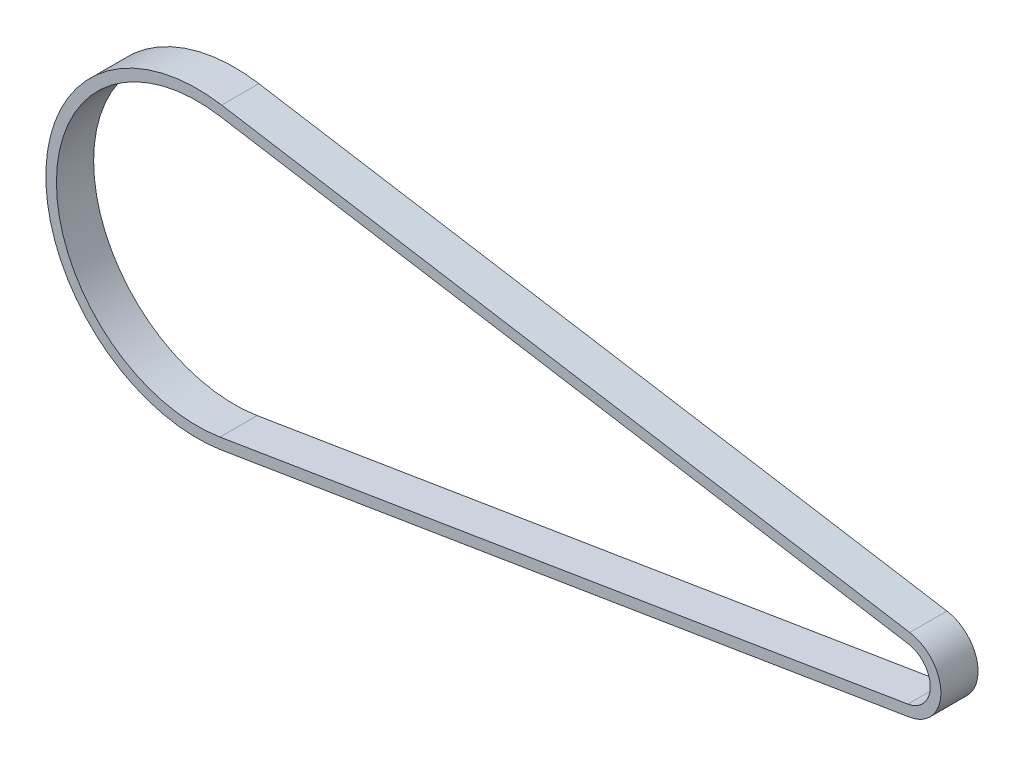
ISO-10303-21;
HEADER;
FILE_DESCRIPTION(('STEP AP214'),'2;1');
FILE_NAME('part.step','',(''),(''),'','','');
FILE_SCHEMA(('AUTOMOTIVE_DESIGN { 1 0 10303 214 1 1 1 1 }'));
ENDSEC;
DATA;
#1=APPLICATION_CONTEXT('core data for automotive mechanical design processes');
#2=APPLICATION_PROTOCOL_DEFINITION('international standard','automotive_design',2000,#1);
#3=PRODUCT_CONTEXT('',#1,'mechanical');
#4=PRODUCT('Part','Part','',(#3));
#5=PRODUCT_RELATED_PRODUCT_CATEGORY('part','',(#4));
#6=PRODUCT_DEFINITION_FORMATION('','',#4);
#7=PRODUCT_DEFINITION_CONTEXT('part definition',#1,'design');
#8=PRODUCT_DEFINITION('design','',#6,#7);
#9=PRODUCT_DEFINITION_SHAPE('','',#8);
#10=(LENGTH_UNIT() NAMED_UNIT(*) SI_UNIT(.MILLI.,.METRE.));
#11=(NAMED_UNIT(*) PLANE_ANGLE_UNIT() SI_UNIT($,.RADIAN.));
#12=(NAMED_UNIT(*) SI_UNIT($,.STERADIAN.) SOLID_ANGLE_UNIT());
#13=UNCERTAINTY_MEASURE_WITH_UNIT(LENGTH_MEASURE(1.E-05),#10,'distance_accuracy_value','');
#14=(GEOMETRIC_REPRESENTATION_CONTEXT(3) GLOBAL_UNCERTAINTY_ASSIGNED_CONTEXT((#13)) GLOBAL_UNIT_ASSIGNED_CONTEXT((#10,
#11,#12)) REPRESENTATION_CONTEXT('',''));
#15=CARTESIAN_POINT('',(0.,0.,0.));
#16=DIRECTION('',(0.,0.,1.));
#17=DIRECTION('',(1.,0.,0.));
#18=AXIS2_PLACEMENT_3D('',#15,#16,#17);
#19=CARTESIAN_POINT('',(0.,0.,7.));
#20=DIRECTION('',(0.,0.,1.));
#21=DIRECTION('',(1.,0.,0.));
#22=AXIS2_PLACEMENT_3D('',#19,#20,#21);
#23=PLANE('',#22);
#24=CARTESIAN_POINT('',(0.,0.,7.));
#25=DIRECTION('',(0.,0.,1.));
#26=DIRECTION('',(1.,0.,0.));
#27=AXIS2_PLACEMENT_3D('',#24,#25,#26);
#28=CIRCLE('',#27,28.5);
#29=CARTESIAN_POINT('',(4.60714285714286,28.125153060808,7.));
#30=VERTEX_POINT('',#29);
#31=CARTESIAN_POINT('',(4.60714285714286,-28.125153060808,7.));
#32=VERTEX_POINT('',#31);
#33=EDGE_CURVE('E134',#30,#32,#28,.T.);
#34=ORIENTED_EDGE('',*,*,#33,.T.);
#35=DIRECTION('',(0.986847475817825,0.161654135338346,0.));
#36=VECTOR('',#35,1.);
#37=CARTESIAN_POINT('',(4.60714285714286,-28.125153060808,7.));
#38=LINE('',#37,#36);
#39=CARTESIAN_POINT('',(134.131578947368,-6.90793233072476,7.));
#40=VERTEX_POINT('',#39);
#41=EDGE_CURVE('E137',#32,#40,#38,.T.);
#42=ORIENTED_EDGE('',*,*,#41,.T.);
#43=CARTESIAN_POINT('',(133.,0.,7.));
#44=DIRECTION('',(0.,0.,1.));
#45=DIRECTION('',(1.,0.,0.));
#46=AXIS2_PLACEMENT_3D('',#43,#44,#45);
#47=CIRCLE('',#46,6.99999999999999);
#48=CARTESIAN_POINT('',(134.131578947368,6.90793233072476,7.));
#49=VERTEX_POINT('',#48);
#50=EDGE_CURVE('E140',#40,#49,#47,.T.);
#51=ORIENTED_EDGE('',*,*,#50,.T.);
#52=DIRECTION('',(-0.986847475817825,0.161654135338346,0.));
#53=VECTOR('',#52,1.);
#54=CARTESIAN_POINT('',(4.60714285714286,28.125153060808,7.));
#55=LINE('',#54,#53);
#56=EDGE_CURVE('E142',#49,#30,#55,.T.);
#57=ORIENTED_EDGE('',*,*,#56,.T.);
#58=EDGE_LOOP('',(#34,#42,#51,#57));
#59=FACE_BOUND('',#58,.T.);
#60=DIRECTION('',(0.986847475817825,0.161654135338346,0.));
#61=VECTOR('',#60,1.);
#62=CARTESIAN_POINT('',(4.28383458646617,-26.1514581091724,7.));
#63=LINE('',#62,#61);
#64=CARTESIAN_POINT('',(4.28383458646617,-26.1514581091724,7.));
#65=VERTEX_POINT('',#64);
#66=CARTESIAN_POINT('',(133.808270676692,-4.93423737908912,7.));
#67=VERTEX_POINT('',#66);
#68=EDGE_CURVE('E106',#65,#67,#63,.T.);
#69=ORIENTED_EDGE('',*,*,#68,.F.);
#70=CARTESIAN_POINT('',(0.,0.,7.));
#71=DIRECTION('',(0.,0.,1.));
#72=DIRECTION('',(1.,0.,0.));
#73=AXIS2_PLACEMENT_3D('',#70,#71,#72);
#74=CIRCLE('',#73,26.5);
#75=CARTESIAN_POINT('',(4.28383458646617,26.1514581091724,7.));
#76=VERTEX_POINT('',#75);
#77=EDGE_CURVE('E98',#76,#65,#74,.T.);
#78=ORIENTED_EDGE('',*,*,#77,.F.);
#79=DIRECTION('',(-0.986847475817825,0.161654135338346,0.));
#80=VECTOR('',#79,1.);
#81=CARTESIAN_POINT('',(4.28383458646617,26.1514581091724,7.));
#82=LINE('',#81,#80);
#83=CARTESIAN_POINT('',(133.808270676692,4.93423737908911,7.));
#84=VERTEX_POINT('',#83);
#85=EDGE_CURVE('E120',#84,#76,#82,.T.);
#86=ORIENTED_EDGE('',*,*,#85,.F.);
#87=CARTESIAN_POINT('',(133.,0.,7.));
#88=DIRECTION('',(0.,0.,1.));
#89=DIRECTION('',(1.,0.,0.));
#90=AXIS2_PLACEMENT_3D('',#87,#88,#89);
#91=CIRCLE('',#90,4.99999999999999);
#92=EDGE_CURVE('E118',#67,#84,#91,.T.);
#93=ORIENTED_EDGE('',*,*,#92,.F.);
#94=EDGE_LOOP('',(#69,#78,#86,#93));
#95=FACE_BOUND('',#94,.T.);
#96=ADVANCED_FACE('F33',(#59,#95),#23,.T.);
#97=CARTESIAN_POINT('',(0.,0.,0.));
#98=DIRECTION('',(0.,0.,1.));
#99=DIRECTION('',(1.,0.,0.));
#100=AXIS2_PLACEMENT_3D('',#97,#98,#99);
#101=PLANE('',#100);
#102=CARTESIAN_POINT('',(0.,0.,0.));
#103=DIRECTION('',(0.,0.,1.));
#104=DIRECTION('',(1.,0.,0.));
#105=AXIS2_PLACEMENT_3D('',#102,#103,#104);
#106=CIRCLE('',#105,28.5);
#107=CARTESIAN_POINT('',(4.60714285714286,28.125153060808,0.));
#108=VERTEX_POINT('',#107);
#109=CARTESIAN_POINT('',(4.60714285714286,-28.125153060808,0.));
#110=VERTEX_POINT('',#109);
#111=EDGE_CURVE('E114',#108,#110,#106,.T.);
#112=ORIENTED_EDGE('',*,*,#111,.F.);
#113=DIRECTION('',(-0.986847475817825,0.161654135338346,0.));
#114=VECTOR('',#113,1.);
#115=CARTESIAN_POINT('',(4.60714285714286,28.125153060808,0.));
#116=LINE('',#115,#114);
#117=CARTESIAN_POINT('',(134.131578947368,6.90793233072476,0.));
#118=VERTEX_POINT('',#117);
#119=EDGE_CURVE('E138',#118,#108,#116,.T.);
#120=ORIENTED_EDGE('',*,*,#119,.F.);
#121=CARTESIAN_POINT('',(133.,0.,0.));
#122=DIRECTION('',(0.,0.,1.));
#123=DIRECTION('',(1.,0.,0.));
#124=AXIS2_PLACEMENT_3D('',#121,#122,#123);
#125=CIRCLE('',#124,6.99999999999999);
#126=CARTESIAN_POINT('',(134.131578947368,-6.90793233072476,0.));
#127=VERTEX_POINT('',#126);
#128=EDGE_CURVE('E149',#127,#118,#125,.T.);
#129=ORIENTED_EDGE('',*,*,#128,.F.);
#130=DIRECTION('',(0.986847475817825,0.161654135338346,0.));
#131=VECTOR('',#130,1.);
#132=CARTESIAN_POINT('',(4.60714285714286,-28.125153060808,0.));
#133=LINE('',#132,#131);
#134=EDGE_CURVE('E147',#110,#127,#133,.T.);
#135=ORIENTED_EDGE('',*,*,#134,.F.);
#136=EDGE_LOOP('',(#112,#120,#129,#135));
#137=FACE_BOUND('',#136,.T.);
#138=CARTESIAN_POINT('',(0.,0.,0.));
#139=DIRECTION('',(0.,0.,1.));
#140=DIRECTION('',(1.,0.,0.));
#141=AXIS2_PLACEMENT_3D('',#138,#139,#140);
#142=CIRCLE('',#141,26.5);
#143=CARTESIAN_POINT('',(4.28383458646617,26.1514581091724,0.));
#144=VERTEX_POINT('',#143);
#145=CARTESIAN_POINT('',(4.28383458646617,-26.1514581091724,0.));
#146=VERTEX_POINT('',#145);
#147=EDGE_CURVE('E56',#144,#146,#142,.T.);
#148=ORIENTED_EDGE('',*,*,#147,.T.);
#149=DIRECTION('',(0.986847475817825,0.161654135338346,0.));
#150=VECTOR('',#149,1.);
#151=CARTESIAN_POINT('',(4.28383458646617,-26.1514581091724,0.));
#152=LINE('',#151,#150);
#153=CARTESIAN_POINT('',(133.808270676692,-4.93423737908912,0.));
#154=VERTEX_POINT('',#153);
#155=EDGE_CURVE('E113',#146,#154,#152,.T.);
#156=ORIENTED_EDGE('',*,*,#155,.T.);
#157=CARTESIAN_POINT('',(133.,0.,0.));
#158=DIRECTION('',(0.,0.,1.));
#159=DIRECTION('',(1.,0.,0.));
#160=AXIS2_PLACEMENT_3D('',#157,#158,#159);
#161=CIRCLE('',#160,4.99999999999999);
#162=CARTESIAN_POINT('',(133.808270676692,4.93423737908912,0.));
#163=VERTEX_POINT('',#162);
#164=EDGE_CURVE('E126',#154,#163,#161,.T.);
#165=ORIENTED_EDGE('',*,*,#164,.T.);
#166=DIRECTION('',(-0.986847475817825,0.161654135338346,0.));
#167=VECTOR('',#166,1.);
#168=CARTESIAN_POINT('',(4.28383458646617,26.1514581091724,0.));
#169=LINE('',#168,#167);
#170=EDGE_CURVE('E107',#163,#144,#169,.T.);
#171=ORIENTED_EDGE('',*,*,#170,.T.);
#172=EDGE_LOOP('',(#148,#156,#165,#171));
#173=FACE_BOUND('',#172,.T.);
#174=ADVANCED_FACE('F167',(#137,#173),#101,.F.);
#175=CARTESIAN_POINT('',(0.,0.,7.));
#176=DIRECTION('',(0.,0.,-1.));
#177=DIRECTION('',(-1.,0.,0.));
#178=AXIS2_PLACEMENT_3D('',#175,#176,#177);
#179=CYLINDRICAL_SURFACE('',#178,28.5);
#180=ORIENTED_EDGE('',*,*,#111,.T.);
#181=DIRECTION('',(0.,0.,-1.));
#182=VECTOR('',#181,1.);
#183=CARTESIAN_POINT('',(4.60714285714286,-28.125153060808,7.));
#184=LINE('',#183,#182);
#185=EDGE_CURVE('E11',#32,#110,#184,.T.);
#186=ORIENTED_EDGE('',*,*,#185,.F.);
#187=ORIENTED_EDGE('',*,*,#33,.F.);
#188=DIRECTION('',(0.,0.,-1.));
#189=VECTOR('',#188,1.);
#190=CARTESIAN_POINT('',(4.60714285714286,28.125153060808,7.));
#191=LINE('',#190,#189);
#192=EDGE_CURVE('E144',#30,#108,#191,.T.);
#193=ORIENTED_EDGE('',*,*,#192,.T.);
#194=EDGE_LOOP('',(#180,#186,#187,#193));
#195=FACE_BOUND('',#194,.T.);
#196=ADVANCED_FACE('F35',(#195),#179,.T.);
#197=CARTESIAN_POINT('',(4.60714285714286,-28.125153060808,7.));
#198=DIRECTION('',(-0.161654135338346,0.986847475817825,0.));
#199=DIRECTION('',(-0.986847475817825,-0.161654135338346,0.));
#200=AXIS2_PLACEMENT_3D('',#197,#198,#199);
#201=PLANE('',#200);
#202=ORIENTED_EDGE('',*,*,#134,.T.);
#203=DIRECTION('',(0.,0.,-1.));
#204=VECTOR('',#203,1.);
#205=CARTESIAN_POINT('',(134.131578947368,-6.90793233072476,7.));
#206=LINE('',#205,#204);
#207=EDGE_CURVE('E41',#40,#127,#206,.T.);
#208=ORIENTED_EDGE('',*,*,#207,.F.);
#209=ORIENTED_EDGE('',*,*,#41,.F.);
#210=ORIENTED_EDGE('',*,*,#185,.T.);
#211=EDGE_LOOP('',(#202,#208,#209,#210));
#212=FACE_BOUND('',#211,.T.);
#213=ADVANCED_FACE('F177',(#212),#201,.F.);
#214=CARTESIAN_POINT('',(133.,0.,7.));
#215=DIRECTION('',(0.,0.,-1.));
#216=DIRECTION('',(-1.,0.,0.));
#217=AXIS2_PLACEMENT_3D('',#214,#215,#216);
#218=CYLINDRICAL_SURFACE('',#217,6.99999999999999);
#219=ORIENTED_EDGE('',*,*,#128,.T.);
#220=DIRECTION('',(0.,0.,-1.));
#221=VECTOR('',#220,1.);
#222=CARTESIAN_POINT('',(134.131578947368,6.90793233072476,7.));
#223=LINE('',#222,#221);
#224=EDGE_CURVE('E154',#49,#118,#223,.T.);
#225=ORIENTED_EDGE('',*,*,#224,.F.);
#226=ORIENTED_EDGE('',*,*,#50,.F.);
#227=ORIENTED_EDGE('',*,*,#207,.T.);
#228=EDGE_LOOP('',(#219,#225,#226,#227));
#229=FACE_BOUND('',#228,.T.);
#230=ADVANCED_FACE('F161',(#229),#218,.T.);
#231=CARTESIAN_POINT('',(4.60714285714286,28.125153060808,7.));
#232=DIRECTION('',(-0.161654135338346,-0.986847475817825,0.));
#233=DIRECTION('',(0.986847475817825,-0.161654135338346,0.));
#234=AXIS2_PLACEMENT_3D('',#231,#232,#233);
#235=PLANE('',#234);
#236=ORIENTED_EDGE('',*,*,#119,.T.);
#237=ORIENTED_EDGE('',*,*,#192,.F.);
#238=ORIENTED_EDGE('',*,*,#56,.F.);
#239=ORIENTED_EDGE('',*,*,#224,.T.);
#240=EDGE_LOOP('',(#236,#237,#238,#239));
#241=FACE_BOUND('',#240,.T.);
#242=ADVANCED_FACE('F171',(#241),#235,.F.);
#243=CARTESIAN_POINT('',(0.,0.,7.));
#244=DIRECTION('',(0.,0.,-1.));
#245=DIRECTION('',(-1.,0.,0.));
#246=AXIS2_PLACEMENT_3D('',#243,#244,#245);
#247=CYLINDRICAL_SURFACE('',#246,26.5);
#248=ORIENTED_EDGE('',*,*,#147,.F.);
#249=DIRECTION('',(0.,0.,-1.));
#250=VECTOR('',#249,1.);
#251=CARTESIAN_POINT('',(4.28383458646617,26.1514581091724,7.));
#252=LINE('',#251,#250);
#253=EDGE_CURVE('E102',#76,#144,#252,.T.);
#254=ORIENTED_EDGE('',*,*,#253,.F.);
#255=ORIENTED_EDGE('',*,*,#77,.T.);
#256=DIRECTION('',(0.,0.,-1.));
#257=VECTOR('',#256,1.);
#258=CARTESIAN_POINT('',(4.28383458646617,-26.1514581091724,7.));
#259=LINE('',#258,#257);
#260=EDGE_CURVE('E101',#65,#146,#259,.T.);
#261=ORIENTED_EDGE('',*,*,#260,.T.);
#262=EDGE_LOOP('',(#248,#254,#255,#261));
#263=FACE_BOUND('',#262,.T.);
#264=ADVANCED_FACE('F100',(#263),#247,.F.);
#265=CARTESIAN_POINT('',(4.28383458646617,-26.1514581091724,7.));
#266=DIRECTION('',(-0.161654135338346,0.986847475817825,0.));
#267=DIRECTION('',(-0.986847475817825,-0.161654135338346,0.));
#268=AXIS2_PLACEMENT_3D('',#265,#266,#267);
#269=PLANE('',#268);
#270=ORIENTED_EDGE('',*,*,#155,.F.);
#271=ORIENTED_EDGE('',*,*,#260,.F.);
#272=ORIENTED_EDGE('',*,*,#68,.T.);
#273=DIRECTION('',(0.,0.,-1.));
#274=VECTOR('',#273,1.);
#275=CARTESIAN_POINT('',(133.808270676692,-4.93423737908912,7.));
#276=LINE('',#275,#274);
#277=EDGE_CURVE('E115',#67,#154,#276,.T.);
#278=ORIENTED_EDGE('',*,*,#277,.T.);
#279=EDGE_LOOP('',(#270,#271,#272,#278));
#280=FACE_BOUND('',#279,.T.);
#281=ADVANCED_FACE('F110',(#280),#269,.T.);
#282=CARTESIAN_POINT('',(133.,0.,7.));
#283=DIRECTION('',(0.,0.,-1.));
#284=DIRECTION('',(-1.,0.,0.));
#285=AXIS2_PLACEMENT_3D('',#282,#283,#284);
#286=CYLINDRICAL_SURFACE('',#285,4.99999999999999);
#287=ORIENTED_EDGE('',*,*,#164,.F.);
#288=ORIENTED_EDGE('',*,*,#277,.F.);
#289=ORIENTED_EDGE('',*,*,#92,.T.);
#290=DIRECTION('',(0.,0.,-1.));
#291=VECTOR('',#290,1.);
#292=CARTESIAN_POINT('',(133.808270676692,4.93423737908912,7.));
#293=LINE('',#292,#291);
#294=EDGE_CURVE('E48',#84,#163,#293,.T.);
#295=ORIENTED_EDGE('',*,*,#294,.T.);
#296=EDGE_LOOP('',(#287,#288,#289,#295));
#297=FACE_BOUND('',#296,.T.);
#298=ADVANCED_FACE('F200',(#297),#286,.F.);
#299=CARTESIAN_POINT('',(4.28383458646617,26.1514581091724,7.));
#300=DIRECTION('',(-0.161654135338346,-0.986847475817825,0.));
#301=DIRECTION('',(0.986847475817825,-0.161654135338346,0.));
#302=AXIS2_PLACEMENT_3D('',#299,#300,#301);
#303=PLANE('',#302);
#304=ORIENTED_EDGE('',*,*,#170,.F.);
#305=ORIENTED_EDGE('',*,*,#294,.F.);
#306=ORIENTED_EDGE('',*,*,#85,.T.);
#307=ORIENTED_EDGE('',*,*,#253,.T.);
#308=EDGE_LOOP('',(#304,#305,#306,#307));
#309=FACE_BOUND('',#308,.T.);
#310=ADVANCED_FACE('F204',(#309),#303,.T.);
#311=CLOSED_SHELL('',(#96,#174,#196,#213,#230,#242,#264,#281,#298,#310));
#312=MANIFOLD_SOLID_BREP('B2',#311);
#313=ADVANCED_BREP_SHAPE_REPRESENTATION('',(#18,#312),#14);
#314=SHAPE_DEFINITION_REPRESENTATION(#9,#313);
ENDSEC;
END-ISO-10303-21;
